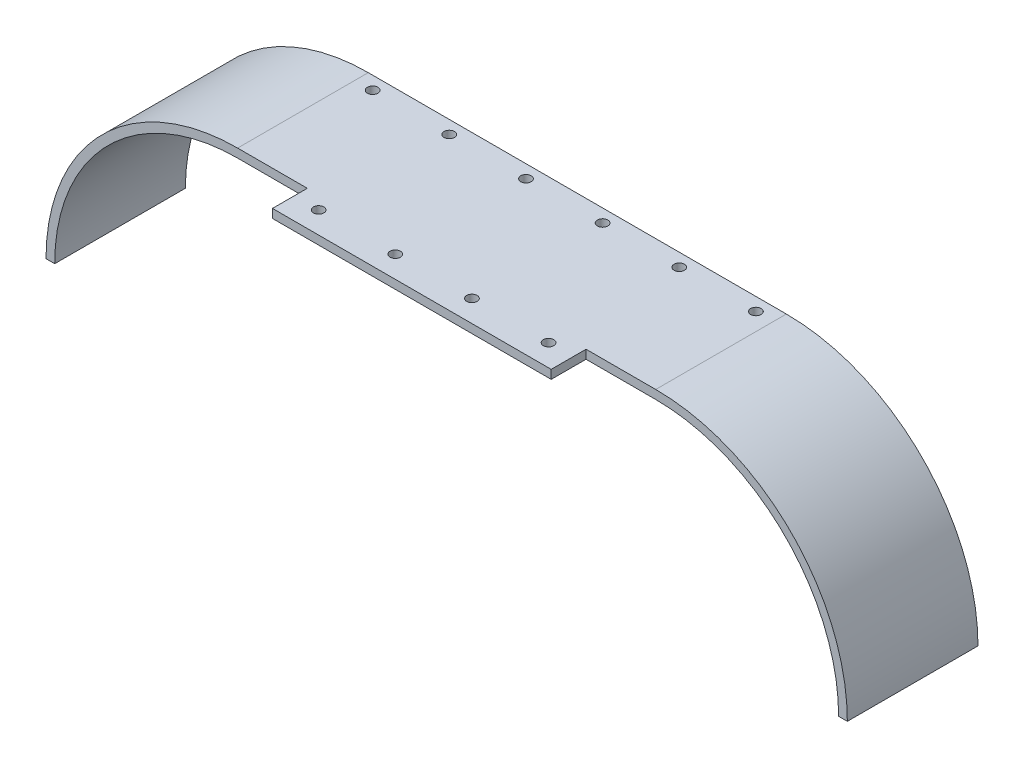
ISO-10303-21;
HEADER;
FILE_DESCRIPTION(('STEP AP214'),'2;1');
FILE_NAME('part.step','',(''),(''),'','','');
FILE_SCHEMA(('AUTOMOTIVE_DESIGN { 1 0 10303 214 1 1 1 1 }'));
ENDSEC;
DATA;
#1=APPLICATION_CONTEXT('core data for automotive mechanical design processes');
#2=APPLICATION_PROTOCOL_DEFINITION('international standard','automotive_design',2000,#1);
#3=PRODUCT_CONTEXT('',#1,'mechanical');
#4=PRODUCT('Part','Part','',(#3));
#5=PRODUCT_RELATED_PRODUCT_CATEGORY('part','',(#4));
#6=PRODUCT_DEFINITION_FORMATION('','',#4);
#7=PRODUCT_DEFINITION_CONTEXT('part definition',#1,'design');
#8=PRODUCT_DEFINITION('design','',#6,#7);
#9=PRODUCT_DEFINITION_SHAPE('','',#8);
#10=(LENGTH_UNIT() NAMED_UNIT(*) SI_UNIT(.MILLI.,.METRE.));
#11=(NAMED_UNIT(*) PLANE_ANGLE_UNIT() SI_UNIT($,.RADIAN.));
#12=(NAMED_UNIT(*) SI_UNIT($,.STERADIAN.) SOLID_ANGLE_UNIT());
#13=UNCERTAINTY_MEASURE_WITH_UNIT(LENGTH_MEASURE(1.E-05),#10,'distance_accuracy_value','');
#14=(GEOMETRIC_REPRESENTATION_CONTEXT(3) GLOBAL_UNCERTAINTY_ASSIGNED_CONTEXT((#13)) GLOBAL_UNIT_ASSIGNED_CONTEXT((#10,
#11,#12)) REPRESENTATION_CONTEXT('',''));
#15=CARTESIAN_POINT('',(0.,0.,0.));
#16=DIRECTION('',(0.,0.,1.));
#17=DIRECTION('',(1.,0.,0.));
#18=AXIS2_PLACEMENT_3D('',#15,#16,#17);
#19=CARTESIAN_POINT('',(0.,0.,37.5));
#20=DIRECTION('',(0.,0.,1.));
#21=DIRECTION('',(1.,0.,0.));
#22=AXIS2_PLACEMENT_3D('',#19,#20,#21);
#23=PLANE('',#22);
#24=DIRECTION('',(0.,-1.,0.));
#25=VECTOR('',#24,1.);
#26=CARTESIAN_POINT('',(-40.,55.,37.5));
#27=LINE('',#26,#25);
#28=CARTESIAN_POINT('',(-40.,55.,37.5));
#29=VERTEX_POINT('',#28);
#30=CARTESIAN_POINT('',(-40.,52.5,37.5));
#31=VERTEX_POINT('',#30);
#32=EDGE_CURVE('E52',#29,#31,#27,.T.);
#33=ORIENTED_EDGE('',*,*,#32,.F.);
#34=DIRECTION('',(1.,0.,0.));
#35=VECTOR('',#34,1.);
#36=CARTESIAN_POINT('',(0.,55.,37.5));
#37=LINE('',#36,#35);
#38=CARTESIAN_POINT('',(-60.,55.,37.5));
#39=VERTEX_POINT('',#38);
#40=EDGE_CURVE('E169',#39,#29,#37,.T.);
#41=ORIENTED_EDGE('',*,*,#40,.F.);
#42=CARTESIAN_POINT('',(-60.,0.,37.5));
#43=DIRECTION('',(0.,0.,1.));
#44=DIRECTION('',(1.,0.,0.));
#45=AXIS2_PLACEMENT_3D('',#42,#43,#44);
#46=CIRCLE('',#45,55.);
#47=CARTESIAN_POINT('',(-115.,0.,37.5));
#48=VERTEX_POINT('',#47);
#49=EDGE_CURVE('E171',#39,#48,#46,.T.);
#50=ORIENTED_EDGE('',*,*,#49,.T.);
#51=DIRECTION('',(1.,0.,0.));
#52=VECTOR('',#51,1.);
#53=CARTESIAN_POINT('',(0.,0.,37.5));
#54=LINE('',#53,#52);
#55=CARTESIAN_POINT('',(-112.5,0.,37.5));
#56=VERTEX_POINT('',#55);
#57=EDGE_CURVE('E165',#48,#56,#54,.T.);
#58=ORIENTED_EDGE('',*,*,#57,.T.);
#59=CARTESIAN_POINT('',(-60.,0.,37.5));
#60=DIRECTION('',(0.,0.,1.));
#61=DIRECTION('',(1.,0.,0.));
#62=AXIS2_PLACEMENT_3D('',#59,#60,#61);
#63=CIRCLE('',#62,52.5);
#64=CARTESIAN_POINT('',(-60.,52.5,37.5));
#65=VERTEX_POINT('',#64);
#66=EDGE_CURVE('E174',#65,#56,#63,.T.);
#67=ORIENTED_EDGE('',*,*,#66,.F.);
#68=DIRECTION('',(1.,0.,0.));
#69=VECTOR('',#68,1.);
#70=CARTESIAN_POINT('',(0.,52.5,37.5));
#71=LINE('',#70,#69);
#72=EDGE_CURVE('E157',#65,#31,#71,.T.);
#73=ORIENTED_EDGE('',*,*,#72,.T.);
#74=EDGE_LOOP('',(#33,#41,#50,#58,#67,#73));
#75=FACE_BOUND('',#74,.T.);
#76=ADVANCED_FACE('F37',(#75),#23,.T.);
#77=CARTESIAN_POINT('',(0.,52.5,37.5));
#78=DIRECTION('',(0.,1.,0.));
#79=DIRECTION('',(0.,0.,1.));
#80=AXIS2_PLACEMENT_3D('',#77,#78,#79);
#81=PLANE('',#80);
#82=CARTESIAN_POINT('',(-55.,52.5,3.75));
#83=DIRECTION('',(0.,1.,0.));
#84=DIRECTION('',(0.,0.,1.));
#85=AXIS2_PLACEMENT_3D('',#82,#83,#84);
#86=CIRCLE('',#85,1.5);
#87=CARTESIAN_POINT('',(-55.,52.5,5.25));
#88=VERTEX_POINT('',#87);
#89=EDGE_CURVE('E270',#88,#88,#86,.T.);
#90=ORIENTED_EDGE('',*,*,#89,.T.);
#91=EDGE_LOOP('',(#90));
#92=FACE_BOUND('',#91,.T.);
#93=CARTESIAN_POINT('',(-33.,52.5,3.75));
#94=DIRECTION('',(0.,1.,0.));
#95=DIRECTION('',(0.,0.,1.));
#96=AXIS2_PLACEMENT_3D('',#93,#94,#95);
#97=CIRCLE('',#96,1.5);
#98=CARTESIAN_POINT('',(-33.,52.5,5.25));
#99=VERTEX_POINT('',#98);
#100=EDGE_CURVE('E280',#99,#99,#97,.T.);
#101=ORIENTED_EDGE('',*,*,#100,.T.);
#102=EDGE_LOOP('',(#101));
#103=FACE_BOUND('',#102,.T.);
#104=CARTESIAN_POINT('',(-11.,52.5,3.75));
#105=DIRECTION('',(0.,1.,0.));
#106=DIRECTION('',(0.,0.,1.));
#107=AXIS2_PLACEMENT_3D('',#104,#105,#106);
#108=CIRCLE('',#107,1.5);
#109=CARTESIAN_POINT('',(-11.,52.5,5.25));
#110=VERTEX_POINT('',#109);
#111=EDGE_CURVE('E283',#110,#110,#108,.T.);
#112=ORIENTED_EDGE('',*,*,#111,.T.);
#113=EDGE_LOOP('',(#112));
#114=FACE_BOUND('',#113,.T.);
#115=CARTESIAN_POINT('',(11.,52.5,3.75));
#116=DIRECTION('',(0.,1.,0.));
#117=DIRECTION('',(0.,0.,1.));
#118=AXIS2_PLACEMENT_3D('',#115,#116,#117);
#119=CIRCLE('',#118,1.5);
#120=CARTESIAN_POINT('',(11.,52.5,5.25));
#121=VERTEX_POINT('',#120);
#122=EDGE_CURVE('E286',#121,#121,#119,.T.);
#123=ORIENTED_EDGE('',*,*,#122,.T.);
#124=EDGE_LOOP('',(#123));
#125=FACE_BOUND('',#124,.T.);
#126=CARTESIAN_POINT('',(33.,52.5,3.75));
#127=DIRECTION('',(0.,1.,0.));
#128=DIRECTION('',(0.,0.,1.));
#129=AXIS2_PLACEMENT_3D('',#126,#127,#128);
#130=CIRCLE('',#129,1.5);
#131=CARTESIAN_POINT('',(33.,52.5,5.25));
#132=VERTEX_POINT('',#131);
#133=EDGE_CURVE('E289',#132,#132,#130,.T.);
#134=ORIENTED_EDGE('',*,*,#133,.T.);
#135=EDGE_LOOP('',(#134));
#136=FACE_BOUND('',#135,.T.);
#137=CARTESIAN_POINT('',(55.,52.5,3.75));
#138=DIRECTION('',(0.,1.,0.));
#139=DIRECTION('',(0.,0.,1.));
#140=AXIS2_PLACEMENT_3D('',#137,#138,#139);
#141=CIRCLE('',#140,1.5);
#142=CARTESIAN_POINT('',(55.,52.5,5.25));
#143=VERTEX_POINT('',#142);
#144=EDGE_CURVE('E292',#143,#143,#141,.T.);
#145=ORIENTED_EDGE('',*,*,#144,.T.);
#146=EDGE_LOOP('',(#145));
#147=FACE_BOUND('',#146,.T.);
#148=CARTESIAN_POINT('',(-33.,52.5,41.25));
#149=DIRECTION('',(0.,1.,0.));
#150=DIRECTION('',(0.,0.,1.));
#151=AXIS2_PLACEMENT_3D('',#148,#149,#150);
#152=CIRCLE('',#151,1.5);
#153=CARTESIAN_POINT('',(-33.,52.5,42.75));
#154=VERTEX_POINT('',#153);
#155=EDGE_CURVE('E251',#154,#154,#152,.T.);
#156=ORIENTED_EDGE('',*,*,#155,.T.);
#157=EDGE_LOOP('',(#156));
#158=FACE_BOUND('',#157,.T.);
#159=CARTESIAN_POINT('',(-11.,52.5,41.25));
#160=DIRECTION('',(0.,1.,0.));
#161=DIRECTION('',(0.,0.,1.));
#162=AXIS2_PLACEMENT_3D('',#159,#160,#161);
#163=CIRCLE('',#162,1.5);
#164=CARTESIAN_POINT('',(-11.,52.5,42.75));
#165=VERTEX_POINT('',#164);
#166=EDGE_CURVE('E256',#165,#165,#163,.T.);
#167=ORIENTED_EDGE('',*,*,#166,.T.);
#168=EDGE_LOOP('',(#167));
#169=FACE_BOUND('',#168,.T.);
#170=CARTESIAN_POINT('',(11.,52.5,41.25));
#171=DIRECTION('',(0.,1.,0.));
#172=DIRECTION('',(0.,0.,1.));
#173=AXIS2_PLACEMENT_3D('',#170,#171,#172);
#174=CIRCLE('',#173,1.5);
#175=CARTESIAN_POINT('',(11.,52.5,42.75));
#176=VERTEX_POINT('',#175);
#177=EDGE_CURVE('E259',#176,#176,#174,.T.);
#178=ORIENTED_EDGE('',*,*,#177,.T.);
#179=EDGE_LOOP('',(#178));
#180=FACE_BOUND('',#179,.T.);
#181=CARTESIAN_POINT('',(33.,52.5,41.25));
#182=DIRECTION('',(0.,1.,0.));
#183=DIRECTION('',(0.,0.,1.));
#184=AXIS2_PLACEMENT_3D('',#181,#182,#183);
#185=CIRCLE('',#184,1.5);
#186=CARTESIAN_POINT('',(33.,52.5,42.75));
#187=VERTEX_POINT('',#186);
#188=EDGE_CURVE('E262',#187,#187,#185,.T.);
#189=ORIENTED_EDGE('',*,*,#188,.T.);
#190=EDGE_LOOP('',(#189));
#191=FACE_BOUND('',#190,.T.);
#192=DIRECTION('',(1.,0.,0.));
#193=VECTOR('',#192,1.);
#194=CARTESIAN_POINT('',(0.,52.5,0.));
#195=LINE('',#194,#193);
#196=CARTESIAN_POINT('',(-60.,52.5,0.));
#197=VERTEX_POINT('',#196);
#198=CARTESIAN_POINT('',(60.,52.5,0.));
#199=VERTEX_POINT('',#198);
#200=EDGE_CURVE('E149',#197,#199,#195,.T.);
#201=ORIENTED_EDGE('',*,*,#200,.T.);
#202=DIRECTION('',(0.,0.,-1.));
#203=VECTOR('',#202,1.);
#204=CARTESIAN_POINT('',(60.,52.5,37.5));
#205=LINE('',#204,#203);
#206=CARTESIAN_POINT('',(60.,52.5,37.5));
#207=VERTEX_POINT('',#206);
#208=EDGE_CURVE('E11',#207,#199,#205,.T.);
#209=ORIENTED_EDGE('',*,*,#208,.F.);
#210=CARTESIAN_POINT('',(40.,52.5,37.5));
#211=VERTEX_POINT('',#210);
#212=EDGE_CURVE('E160',#211,#207,#71,.T.);
#213=ORIENTED_EDGE('',*,*,#212,.F.);
#214=DIRECTION('',(0.,0.,-1.));
#215=VECTOR('',#214,1.);
#216=CARTESIAN_POINT('',(40.,52.5,47.5));
#217=LINE('',#216,#215);
#218=CARTESIAN_POINT('',(40.,52.5,47.5));
#219=VERTEX_POINT('',#218);
#220=EDGE_CURVE('E134',#219,#211,#217,.T.);
#221=ORIENTED_EDGE('',*,*,#220,.F.);
#222=DIRECTION('',(1.,0.,0.));
#223=VECTOR('',#222,1.);
#224=CARTESIAN_POINT('',(-40.,52.5,47.5));
#225=LINE('',#224,#223);
#226=CARTESIAN_POINT('',(-40.,52.5,47.5));
#227=VERTEX_POINT('',#226);
#228=EDGE_CURVE('E127',#227,#219,#225,.T.);
#229=ORIENTED_EDGE('',*,*,#228,.F.);
#230=DIRECTION('',(0.,0.,-1.));
#231=VECTOR('',#230,1.);
#232=CARTESIAN_POINT('',(-40.,52.5,47.5));
#233=LINE('',#232,#231);
#234=EDGE_CURVE('E132',#227,#31,#233,.T.);
#235=ORIENTED_EDGE('',*,*,#234,.T.);
#236=ORIENTED_EDGE('',*,*,#72,.F.);
#237=DIRECTION('',(0.,0.,-1.));
#238=VECTOR('',#237,1.);
#239=CARTESIAN_POINT('',(-60.,52.5,37.5));
#240=LINE('',#239,#238);
#241=EDGE_CURVE('E177',#65,#197,#240,.T.);
#242=ORIENTED_EDGE('',*,*,#241,.T.);
#243=EDGE_LOOP('',(#201,#209,#213,#221,#229,#235,#236,#242));
#244=FACE_BOUND('',#243,.T.);
#245=ADVANCED_FACE('F39',(#92,#103,#114,#125,#136,#147,#158,#169,#180,#191,#244),#81,.F.);
#246=CARTESIAN_POINT('',(60.,0.,37.5));
#247=DIRECTION('',(0.,0.,-1.));
#248=DIRECTION('',(-1.,0.,0.));
#249=AXIS2_PLACEMENT_3D('',#246,#247,#248);
#250=CYLINDRICAL_SURFACE('',#249,52.5);
#251=CARTESIAN_POINT('',(60.,0.,0.));
#252=DIRECTION('',(0.,0.,1.));
#253=DIRECTION('',(1.,0.,0.));
#254=AXIS2_PLACEMENT_3D('',#251,#252,#253);
#255=CIRCLE('',#254,52.5);
#256=CARTESIAN_POINT('',(112.5,0.,0.));
#257=VERTEX_POINT('',#256);
#258=EDGE_CURVE('E151',#199,#257,#255,.F.);
#259=ORIENTED_EDGE('',*,*,#258,.T.);
#260=DIRECTION('',(0.,0.,-1.));
#261=VECTOR('',#260,1.);
#262=CARTESIAN_POINT('',(112.5,0.,37.5));
#263=LINE('',#262,#261);
#264=CARTESIAN_POINT('',(112.5,0.,37.5));
#265=VERTEX_POINT('',#264);
#266=EDGE_CURVE('E45',#265,#257,#263,.T.);
#267=ORIENTED_EDGE('',*,*,#266,.F.);
#268=CARTESIAN_POINT('',(60.,0.,37.5));
#269=DIRECTION('',(0.,0.,1.));
#270=DIRECTION('',(1.,0.,0.));
#271=AXIS2_PLACEMENT_3D('',#268,#269,#270);
#272=CIRCLE('',#271,52.5);
#273=EDGE_CURVE('E159',#207,#265,#272,.F.);
#274=ORIENTED_EDGE('',*,*,#273,.F.);
#275=ORIENTED_EDGE('',*,*,#208,.T.);
#276=EDGE_LOOP('',(#259,#267,#274,#275));
#277=FACE_BOUND('',#276,.T.);
#278=ADVANCED_FACE('F227',(#277),#250,.F.);
#279=CARTESIAN_POINT('',(0.,0.,37.5));
#280=DIRECTION('',(0.,1.,0.));
#281=DIRECTION('',(0.,0.,1.));
#282=AXIS2_PLACEMENT_3D('',#279,#280,#281);
#283=PLANE('',#282);
#284=DIRECTION('',(1.,0.,0.));
#285=VECTOR('',#284,1.);
#286=CARTESIAN_POINT('',(0.,0.,0.));
#287=LINE('',#286,#285);
#288=CARTESIAN_POINT('',(115.,0.,0.));
#289=VERTEX_POINT('',#288);
#290=EDGE_CURVE('E180',#257,#289,#287,.T.);
#291=ORIENTED_EDGE('',*,*,#290,.T.);
#292=DIRECTION('',(0.,0.,-1.));
#293=VECTOR('',#292,1.);
#294=CARTESIAN_POINT('',(115.,0.,37.5));
#295=LINE('',#294,#293);
#296=CARTESIAN_POINT('',(115.,0.,37.5));
#297=VERTEX_POINT('',#296);
#298=EDGE_CURVE('E205',#297,#289,#295,.T.);
#299=ORIENTED_EDGE('',*,*,#298,.F.);
#300=EDGE_CURVE('E162',#265,#297,#54,.T.);
#301=ORIENTED_EDGE('',*,*,#300,.F.);
#302=ORIENTED_EDGE('',*,*,#266,.T.);
#303=EDGE_LOOP('',(#291,#299,#301,#302));
#304=FACE_BOUND('',#303,.T.);
#305=ADVANCED_FACE('F211',(#304),#283,.F.);
#306=CARTESIAN_POINT('',(60.,0.,37.5));
#307=DIRECTION('',(0.,0.,-1.));
#308=DIRECTION('',(-1.,0.,0.));
#309=AXIS2_PLACEMENT_3D('',#306,#307,#308);
#310=CYLINDRICAL_SURFACE('',#309,55.);
#311=CARTESIAN_POINT('',(60.,0.,0.));
#312=DIRECTION('',(0.,0.,1.));
#313=DIRECTION('',(1.,0.,0.));
#314=AXIS2_PLACEMENT_3D('',#311,#312,#313);
#315=CIRCLE('',#314,55.);
#316=CARTESIAN_POINT('',(60.,55.,0.));
#317=VERTEX_POINT('',#316);
#318=EDGE_CURVE('E183',#317,#289,#315,.F.);
#319=ORIENTED_EDGE('',*,*,#318,.F.);
#320=DIRECTION('',(0.,0.,-1.));
#321=VECTOR('',#320,1.);
#322=CARTESIAN_POINT('',(60.,55.,37.5));
#323=LINE('',#322,#321);
#324=CARTESIAN_POINT('',(60.,55.,37.5));
#325=VERTEX_POINT('',#324);
#326=EDGE_CURVE('E203',#325,#317,#323,.T.);
#327=ORIENTED_EDGE('',*,*,#326,.F.);
#328=CARTESIAN_POINT('',(60.,0.,37.5));
#329=DIRECTION('',(0.,0.,1.));
#330=DIRECTION('',(1.,0.,0.));
#331=AXIS2_PLACEMENT_3D('',#328,#329,#330);
#332=CIRCLE('',#331,55.);
#333=EDGE_CURVE('E164',#325,#297,#332,.F.);
#334=ORIENTED_EDGE('',*,*,#333,.T.);
#335=ORIENTED_EDGE('',*,*,#298,.T.);
#336=EDGE_LOOP('',(#319,#327,#334,#335));
#337=FACE_BOUND('',#336,.T.);
#338=ADVANCED_FACE('F223',(#337),#310,.T.);
#339=CARTESIAN_POINT('',(0.,55.,37.5));
#340=DIRECTION('',(0.,1.,0.));
#341=DIRECTION('',(0.,0.,1.));
#342=AXIS2_PLACEMENT_3D('',#339,#340,#341);
#343=PLANE('',#342);
#344=CARTESIAN_POINT('',(-55.,55.,3.75));
#345=DIRECTION('',(0.,1.,0.));
#346=DIRECTION('',(0.,0.,1.));
#347=AXIS2_PLACEMENT_3D('',#344,#345,#346);
#348=CIRCLE('',#347,1.5);
#349=CARTESIAN_POINT('',(-55.,55.,5.25));
#350=VERTEX_POINT('',#349);
#351=EDGE_CURVE('E295',#350,#350,#348,.T.);
#352=ORIENTED_EDGE('',*,*,#351,.F.);
#353=EDGE_LOOP('',(#352));
#354=FACE_BOUND('',#353,.T.);
#355=CARTESIAN_POINT('',(-33.,55.,3.75));
#356=DIRECTION('',(0.,1.,0.));
#357=DIRECTION('',(0.,0.,1.));
#358=AXIS2_PLACEMENT_3D('',#355,#356,#357);
#359=CIRCLE('',#358,1.5);
#360=CARTESIAN_POINT('',(-33.,55.,5.25));
#361=VERTEX_POINT('',#360);
#362=EDGE_CURVE('E308',#361,#361,#359,.T.);
#363=ORIENTED_EDGE('',*,*,#362,.F.);
#364=EDGE_LOOP('',(#363));
#365=FACE_BOUND('',#364,.T.);
#366=CARTESIAN_POINT('',(-11.,55.,3.75));
#367=DIRECTION('',(0.,1.,0.));
#368=DIRECTION('',(0.,0.,1.));
#369=AXIS2_PLACEMENT_3D('',#366,#367,#368);
#370=CIRCLE('',#369,1.5);
#371=CARTESIAN_POINT('',(-11.,55.,5.25));
#372=VERTEX_POINT('',#371);
#373=EDGE_CURVE('E305',#372,#372,#370,.T.);
#374=ORIENTED_EDGE('',*,*,#373,.F.);
#375=EDGE_LOOP('',(#374));
#376=FACE_BOUND('',#375,.T.);
#377=CARTESIAN_POINT('',(11.,55.,3.75));
#378=DIRECTION('',(0.,1.,0.));
#379=DIRECTION('',(0.,0.,1.));
#380=AXIS2_PLACEMENT_3D('',#377,#378,#379);
#381=CIRCLE('',#380,1.5);
#382=CARTESIAN_POINT('',(11.,55.,5.25));
#383=VERTEX_POINT('',#382);
#384=EDGE_CURVE('E302',#383,#383,#381,.T.);
#385=ORIENTED_EDGE('',*,*,#384,.F.);
#386=EDGE_LOOP('',(#385));
#387=FACE_BOUND('',#386,.T.);
#388=CARTESIAN_POINT('',(33.,55.,3.75));
#389=DIRECTION('',(0.,1.,0.));
#390=DIRECTION('',(0.,0.,1.));
#391=AXIS2_PLACEMENT_3D('',#388,#389,#390);
#392=CIRCLE('',#391,1.5);
#393=CARTESIAN_POINT('',(33.,55.,5.25));
#394=VERTEX_POINT('',#393);
#395=EDGE_CURVE('E299',#394,#394,#392,.T.);
#396=ORIENTED_EDGE('',*,*,#395,.F.);
#397=EDGE_LOOP('',(#396));
#398=FACE_BOUND('',#397,.T.);
#399=CARTESIAN_POINT('',(55.,55.,3.75));
#400=DIRECTION('',(0.,1.,0.));
#401=DIRECTION('',(0.,0.,1.));
#402=AXIS2_PLACEMENT_3D('',#399,#400,#401);
#403=CIRCLE('',#402,1.5);
#404=CARTESIAN_POINT('',(55.,55.,5.25));
#405=VERTEX_POINT('',#404);
#406=EDGE_CURVE('E296',#405,#405,#403,.T.);
#407=ORIENTED_EDGE('',*,*,#406,.F.);
#408=EDGE_LOOP('',(#407));
#409=FACE_BOUND('',#408,.T.);
#410=CARTESIAN_POINT('',(-33.,55.,41.25));
#411=DIRECTION('',(0.,1.,0.));
#412=DIRECTION('',(0.,0.,1.));
#413=AXIS2_PLACEMENT_3D('',#410,#411,#412);
#414=CIRCLE('',#413,1.5);
#415=CARTESIAN_POINT('',(-33.,55.,42.75));
#416=VERTEX_POINT('',#415);
#417=EDGE_CURVE('E265',#416,#416,#414,.T.);
#418=ORIENTED_EDGE('',*,*,#417,.F.);
#419=EDGE_LOOP('',(#418));
#420=FACE_BOUND('',#419,.T.);
#421=CARTESIAN_POINT('',(-11.,55.,41.25));
#422=DIRECTION('',(0.,1.,0.));
#423=DIRECTION('',(0.,0.,1.));
#424=AXIS2_PLACEMENT_3D('',#421,#422,#423);
#425=CIRCLE('',#424,1.5);
#426=CARTESIAN_POINT('',(-11.,55.,42.75));
#427=VERTEX_POINT('',#426);
#428=EDGE_CURVE('E273',#427,#427,#425,.T.);
#429=ORIENTED_EDGE('',*,*,#428,.F.);
#430=EDGE_LOOP('',(#429));
#431=FACE_BOUND('',#430,.T.);
#432=CARTESIAN_POINT('',(11.,55.,41.25));
#433=DIRECTION('',(0.,1.,0.));
#434=DIRECTION('',(0.,0.,1.));
#435=AXIS2_PLACEMENT_3D('',#432,#433,#434);
#436=CIRCLE('',#435,1.5);
#437=CARTESIAN_POINT('',(11.,55.,42.75));
#438=VERTEX_POINT('',#437);
#439=EDGE_CURVE('E269',#438,#438,#436,.T.);
#440=ORIENTED_EDGE('',*,*,#439,.F.);
#441=EDGE_LOOP('',(#440));
#442=FACE_BOUND('',#441,.T.);
#443=CARTESIAN_POINT('',(33.,55.,41.25));
#444=DIRECTION('',(0.,1.,0.));
#445=DIRECTION('',(0.,0.,1.));
#446=AXIS2_PLACEMENT_3D('',#443,#444,#445);
#447=CIRCLE('',#446,1.5);
#448=CARTESIAN_POINT('',(33.,55.,42.75));
#449=VERTEX_POINT('',#448);
#450=EDGE_CURVE('E266',#449,#449,#447,.T.);
#451=ORIENTED_EDGE('',*,*,#450,.F.);
#452=EDGE_LOOP('',(#451));
#453=FACE_BOUND('',#452,.T.);
#454=DIRECTION('',(1.,0.,0.));
#455=VECTOR('',#454,1.);
#456=CARTESIAN_POINT('',(0.,55.,0.));
#457=LINE('',#456,#455);
#458=CARTESIAN_POINT('',(-60.,55.,0.));
#459=VERTEX_POINT('',#458);
#460=EDGE_CURVE('E187',#459,#317,#457,.T.);
#461=ORIENTED_EDGE('',*,*,#460,.F.);
#462=DIRECTION('',(0.,0.,-1.));
#463=VECTOR('',#462,1.);
#464=CARTESIAN_POINT('',(-60.,55.,37.5));
#465=LINE('',#464,#463);
#466=EDGE_CURVE('E201',#39,#459,#465,.T.);
#467=ORIENTED_EDGE('',*,*,#466,.F.);
#468=ORIENTED_EDGE('',*,*,#40,.T.);
#469=DIRECTION('',(0.,0.,-1.));
#470=VECTOR('',#469,1.);
#471=CARTESIAN_POINT('',(-40.,55.,47.5));
#472=LINE('',#471,#470);
#473=CARTESIAN_POINT('',(-40.,55.,47.5));
#474=VERTEX_POINT('',#473);
#475=EDGE_CURVE('E246',#474,#29,#472,.T.);
#476=ORIENTED_EDGE('',*,*,#475,.F.);
#477=DIRECTION('',(-1.,0.,0.));
#478=VECTOR('',#477,1.);
#479=CARTESIAN_POINT('',(-40.,55.,47.5));
#480=LINE('',#479,#478);
#481=CARTESIAN_POINT('',(40.,55.,47.5));
#482=VERTEX_POINT('',#481);
#483=EDGE_CURVE('E143',#482,#474,#480,.T.);
#484=ORIENTED_EDGE('',*,*,#483,.F.);
#485=DIRECTION('',(0.,0.,-1.));
#486=VECTOR('',#485,1.);
#487=CARTESIAN_POINT('',(40.,55.,47.5));
#488=LINE('',#487,#486);
#489=CARTESIAN_POINT('',(40.,55.,37.5));
#490=VERTEX_POINT('',#489);
#491=EDGE_CURVE('E153',#482,#490,#488,.T.);
#492=ORIENTED_EDGE('',*,*,#491,.T.);
#493=EDGE_CURVE('E168',#490,#325,#37,.T.);
#494=ORIENTED_EDGE('',*,*,#493,.T.);
#495=ORIENTED_EDGE('',*,*,#326,.T.);
#496=EDGE_LOOP('',(#461,#467,#468,#476,#484,#492,#494,#495));
#497=FACE_BOUND('',#496,.T.);
#498=ADVANCED_FACE('F241',(#354,#365,#376,#387,#398,#409,#420,#431,#442,#453,#497),#343,.T.);
#499=CARTESIAN_POINT('',(-60.,0.,37.5));
#500=DIRECTION('',(0.,0.,-1.));
#501=DIRECTION('',(-1.,0.,0.));
#502=AXIS2_PLACEMENT_3D('',#499,#500,#501);
#503=CYLINDRICAL_SURFACE('',#502,55.);
#504=CARTESIAN_POINT('',(-60.,0.,0.));
#505=DIRECTION('',(0.,0.,1.));
#506=DIRECTION('',(1.,0.,0.));
#507=AXIS2_PLACEMENT_3D('',#504,#505,#506);
#508=CIRCLE('',#507,55.);
#509=CARTESIAN_POINT('',(-115.,0.,0.));
#510=VERTEX_POINT('',#509);
#511=EDGE_CURVE('E190',#459,#510,#508,.T.);
#512=ORIENTED_EDGE('',*,*,#511,.T.);
#513=DIRECTION('',(0.,0.,-1.));
#514=VECTOR('',#513,1.);
#515=CARTESIAN_POINT('',(-115.,0.,37.5));
#516=LINE('',#515,#514);
#517=EDGE_CURVE('E198',#48,#510,#516,.T.);
#518=ORIENTED_EDGE('',*,*,#517,.F.);
#519=ORIENTED_EDGE('',*,*,#49,.F.);
#520=ORIENTED_EDGE('',*,*,#466,.T.);
#521=EDGE_LOOP('',(#512,#518,#519,#520));
#522=FACE_BOUND('',#521,.T.);
#523=ADVANCED_FACE('F319',(#522),#503,.T.);
#524=CARTESIAN_POINT('',(-112.5,0.,0.));
#525=VERTEX_POINT('',#524);
#526=EDGE_CURVE('E184',#510,#525,#287,.T.);
#527=ORIENTED_EDGE('',*,*,#526,.T.);
#528=DIRECTION('',(0.,0.,-1.));
#529=VECTOR('',#528,1.);
#530=CARTESIAN_POINT('',(-112.5,0.,37.5));
#531=LINE('',#530,#529);
#532=EDGE_CURVE('E196',#56,#525,#531,.T.);
#533=ORIENTED_EDGE('',*,*,#532,.F.);
#534=ORIENTED_EDGE('',*,*,#57,.F.);
#535=ORIENTED_EDGE('',*,*,#517,.T.);
#536=EDGE_LOOP('',(#527,#533,#534,#535));
#537=FACE_BOUND('',#536,.T.);
#538=ADVANCED_FACE('F237',(#537),#283,.F.);
#539=CARTESIAN_POINT('',(-60.,0.,37.5));
#540=DIRECTION('',(0.,0.,-1.));
#541=DIRECTION('',(-1.,0.,0.));
#542=AXIS2_PLACEMENT_3D('',#539,#540,#541);
#543=CYLINDRICAL_SURFACE('',#542,52.5);
#544=CARTESIAN_POINT('',(-60.,0.,0.));
#545=DIRECTION('',(0.,0.,1.));
#546=DIRECTION('',(1.,0.,0.));
#547=AXIS2_PLACEMENT_3D('',#544,#545,#546);
#548=CIRCLE('',#547,52.5);
#549=EDGE_CURVE('E192',#197,#525,#548,.T.);
#550=ORIENTED_EDGE('',*,*,#549,.F.);
#551=ORIENTED_EDGE('',*,*,#241,.F.);
#552=ORIENTED_EDGE('',*,*,#66,.T.);
#553=ORIENTED_EDGE('',*,*,#532,.T.);
#554=EDGE_LOOP('',(#550,#551,#552,#553));
#555=FACE_BOUND('',#554,.T.);
#556=ADVANCED_FACE('F231',(#555),#543,.F.);
#557=DIRECTION('',(0.,1.,0.));
#558=VECTOR('',#557,1.);
#559=CARTESIAN_POINT('',(40.,55.,37.5));
#560=LINE('',#559,#558);
#561=EDGE_CURVE('E60',#211,#490,#560,.T.);
#562=ORIENTED_EDGE('',*,*,#561,.F.);
#563=ORIENTED_EDGE('',*,*,#212,.T.);
#564=ORIENTED_EDGE('',*,*,#273,.T.);
#565=ORIENTED_EDGE('',*,*,#300,.T.);
#566=ORIENTED_EDGE('',*,*,#333,.F.);
#567=ORIENTED_EDGE('',*,*,#493,.F.);
#568=EDGE_LOOP('',(#562,#563,#564,#565,#566,#567));
#569=FACE_BOUND('',#568,.T.);
#570=ADVANCED_FACE('F225',(#569),#23,.T.);
#571=CARTESIAN_POINT('',(0.,0.,0.));
#572=DIRECTION('',(0.,0.,1.));
#573=DIRECTION('',(1.,0.,0.));
#574=AXIS2_PLACEMENT_3D('',#571,#572,#573);
#575=PLANE('',#574);
#576=ORIENTED_EDGE('',*,*,#200,.F.);
#577=ORIENTED_EDGE('',*,*,#549,.T.);
#578=ORIENTED_EDGE('',*,*,#526,.F.);
#579=ORIENTED_EDGE('',*,*,#511,.F.);
#580=ORIENTED_EDGE('',*,*,#460,.T.);
#581=ORIENTED_EDGE('',*,*,#318,.T.);
#582=ORIENTED_EDGE('',*,*,#290,.F.);
#583=ORIENTED_EDGE('',*,*,#258,.F.);
#584=EDGE_LOOP('',(#576,#577,#578,#579,#580,#581,#582,#583));
#585=FACE_BOUND('',#584,.T.);
#586=ADVANCED_FACE('F217',(#585),#575,.F.);
#587=CARTESIAN_POINT('',(-40.,55.,47.5));
#588=DIRECTION('',(1.,0.,0.));
#589=DIRECTION('',(0.,0.,-1.));
#590=AXIS2_PLACEMENT_3D('',#587,#588,#589);
#591=PLANE('',#590);
#592=ORIENTED_EDGE('',*,*,#32,.T.);
#593=ORIENTED_EDGE('',*,*,#234,.F.);
#594=DIRECTION('',(0.,-1.,0.));
#595=VECTOR('',#594,1.);
#596=CARTESIAN_POINT('',(-40.,55.,47.5));
#597=LINE('',#596,#595);
#598=EDGE_CURVE('E138',#474,#227,#597,.T.);
#599=ORIENTED_EDGE('',*,*,#598,.F.);
#600=ORIENTED_EDGE('',*,*,#475,.T.);
#601=EDGE_LOOP('',(#592,#593,#599,#600));
#602=FACE_BOUND('',#601,.T.);
#603=ADVANCED_FACE('F148',(#602),#591,.F.);
#604=CARTESIAN_POINT('',(40.,55.,47.5));
#605=DIRECTION('',(-1.,0.,0.));
#606=DIRECTION('',(0.,0.,1.));
#607=AXIS2_PLACEMENT_3D('',#604,#605,#606);
#608=PLANE('',#607);
#609=ORIENTED_EDGE('',*,*,#561,.T.);
#610=ORIENTED_EDGE('',*,*,#491,.F.);
#611=DIRECTION('',(0.,1.,0.));
#612=VECTOR('',#611,1.);
#613=CARTESIAN_POINT('',(40.,55.,47.5));
#614=LINE('',#613,#612);
#615=EDGE_CURVE('E137',#219,#482,#614,.T.);
#616=ORIENTED_EDGE('',*,*,#615,.F.);
#617=ORIENTED_EDGE('',*,*,#220,.T.);
#618=EDGE_LOOP('',(#609,#610,#616,#617));
#619=FACE_BOUND('',#618,.T.);
#620=ADVANCED_FACE('F385',(#619),#608,.F.);
#621=CARTESIAN_POINT('',(0.,0.,47.5));
#622=DIRECTION('',(0.,0.,1.));
#623=DIRECTION('',(1.,0.,0.));
#624=AXIS2_PLACEMENT_3D('',#621,#622,#623);
#625=PLANE('',#624);
#626=ORIENTED_EDGE('',*,*,#598,.T.);
#627=ORIENTED_EDGE('',*,*,#228,.T.);
#628=ORIENTED_EDGE('',*,*,#615,.T.);
#629=ORIENTED_EDGE('',*,*,#483,.T.);
#630=EDGE_LOOP('',(#626,#627,#628,#629));
#631=FACE_BOUND('',#630,.T.);
#632=ADVANCED_FACE('F141',(#631),#625,.T.);
#633=CARTESIAN_POINT('',(33.,45.,41.25));
#634=DIRECTION('',(0.,1.,0.));
#635=DIRECTION('',(0.,0.,1.));
#636=AXIS2_PLACEMENT_3D('',#633,#634,#635);
#637=CYLINDRICAL_SURFACE('',#636,1.5);
#638=ORIENTED_EDGE('',*,*,#450,.T.);
#639=EDGE_LOOP('',(#638));
#640=FACE_BOUND('',#639,.T.);
#641=ORIENTED_EDGE('',*,*,#188,.F.);
#642=EDGE_LOOP('',(#641));
#643=FACE_BOUND('',#642,.T.);
#644=ADVANCED_FACE('F339',(#640,#643),#637,.F.);
#645=CARTESIAN_POINT('',(11.,45.,41.25));
#646=DIRECTION('',(0.,1.,0.));
#647=DIRECTION('',(0.,0.,1.));
#648=AXIS2_PLACEMENT_3D('',#645,#646,#647);
#649=CYLINDRICAL_SURFACE('',#648,1.5);
#650=ORIENTED_EDGE('',*,*,#439,.T.);
#651=EDGE_LOOP('',(#650));
#652=FACE_BOUND('',#651,.T.);
#653=ORIENTED_EDGE('',*,*,#177,.F.);
#654=EDGE_LOOP('',(#653));
#655=FACE_BOUND('',#654,.T.);
#656=ADVANCED_FACE('F342',(#652,#655),#649,.F.);
#657=CARTESIAN_POINT('',(-11.,45.,41.25));
#658=DIRECTION('',(0.,1.,0.));
#659=DIRECTION('',(0.,0.,1.));
#660=AXIS2_PLACEMENT_3D('',#657,#658,#659);
#661=CYLINDRICAL_SURFACE('',#660,1.5);
#662=ORIENTED_EDGE('',*,*,#428,.T.);
#663=EDGE_LOOP('',(#662));
#664=FACE_BOUND('',#663,.T.);
#665=ORIENTED_EDGE('',*,*,#166,.F.);
#666=EDGE_LOOP('',(#665));
#667=FACE_BOUND('',#666,.T.);
#668=ADVANCED_FACE('F372',(#664,#667),#661,.F.);
#669=CARTESIAN_POINT('',(-33.,45.,41.25));
#670=DIRECTION('',(0.,1.,0.));
#671=DIRECTION('',(0.,0.,1.));
#672=AXIS2_PLACEMENT_3D('',#669,#670,#671);
#673=CYLINDRICAL_SURFACE('',#672,1.5);
#674=ORIENTED_EDGE('',*,*,#417,.T.);
#675=EDGE_LOOP('',(#674));
#676=FACE_BOUND('',#675,.T.);
#677=ORIENTED_EDGE('',*,*,#155,.F.);
#678=EDGE_LOOP('',(#677));
#679=FACE_BOUND('',#678,.T.);
#680=ADVANCED_FACE('F378',(#676,#679),#673,.F.);
#681=CARTESIAN_POINT('',(55.,45.,3.75));
#682=DIRECTION('',(0.,1.,0.));
#683=DIRECTION('',(0.,0.,1.));
#684=AXIS2_PLACEMENT_3D('',#681,#682,#683);
#685=CYLINDRICAL_SURFACE('',#684,1.5);
#686=ORIENTED_EDGE('',*,*,#406,.T.);
#687=EDGE_LOOP('',(#686));
#688=FACE_BOUND('',#687,.T.);
#689=ORIENTED_EDGE('',*,*,#144,.F.);
#690=EDGE_LOOP('',(#689));
#691=FACE_BOUND('',#690,.T.);
#692=ADVANCED_FACE('F473',(#688,#691),#685,.F.);
#693=CARTESIAN_POINT('',(33.,45.,3.75));
#694=DIRECTION('',(0.,1.,0.));
#695=DIRECTION('',(0.,0.,1.));
#696=AXIS2_PLACEMENT_3D('',#693,#694,#695);
#697=CYLINDRICAL_SURFACE('',#696,1.5);
#698=ORIENTED_EDGE('',*,*,#395,.T.);
#699=EDGE_LOOP('',(#698));
#700=FACE_BOUND('',#699,.T.);
#701=ORIENTED_EDGE('',*,*,#133,.F.);
#702=EDGE_LOOP('',(#701));
#703=FACE_BOUND('',#702,.T.);
#704=ADVANCED_FACE('F478',(#700,#703),#697,.F.);
#705=CARTESIAN_POINT('',(11.,45.,3.75));
#706=DIRECTION('',(0.,1.,0.));
#707=DIRECTION('',(0.,0.,1.));
#708=AXIS2_PLACEMENT_3D('',#705,#706,#707);
#709=CYLINDRICAL_SURFACE('',#708,1.5);
#710=ORIENTED_EDGE('',*,*,#384,.T.);
#711=EDGE_LOOP('',(#710));
#712=FACE_BOUND('',#711,.T.);
#713=ORIENTED_EDGE('',*,*,#122,.F.);
#714=EDGE_LOOP('',(#713));
#715=FACE_BOUND('',#714,.T.);
#716=ADVANCED_FACE('F488',(#712,#715),#709,.F.);
#717=CARTESIAN_POINT('',(-11.,45.,3.75));
#718=DIRECTION('',(0.,1.,0.));
#719=DIRECTION('',(0.,0.,1.));
#720=AXIS2_PLACEMENT_3D('',#717,#718,#719);
#721=CYLINDRICAL_SURFACE('',#720,1.5);
#722=ORIENTED_EDGE('',*,*,#373,.T.);
#723=EDGE_LOOP('',(#722));
#724=FACE_BOUND('',#723,.T.);
#725=ORIENTED_EDGE('',*,*,#111,.F.);
#726=EDGE_LOOP('',(#725));
#727=FACE_BOUND('',#726,.T.);
#728=ADVANCED_FACE('F498',(#724,#727),#721,.F.);
#729=CARTESIAN_POINT('',(-33.,45.,3.75));
#730=DIRECTION('',(0.,1.,0.));
#731=DIRECTION('',(0.,0.,1.));
#732=AXIS2_PLACEMENT_3D('',#729,#730,#731);
#733=CYLINDRICAL_SURFACE('',#732,1.5);
#734=ORIENTED_EDGE('',*,*,#362,.T.);
#735=EDGE_LOOP('',(#734));
#736=FACE_BOUND('',#735,.T.);
#737=ORIENTED_EDGE('',*,*,#100,.F.);
#738=EDGE_LOOP('',(#737));
#739=FACE_BOUND('',#738,.T.);
#740=ADVANCED_FACE('F508',(#736,#739),#733,.F.);
#741=CARTESIAN_POINT('',(-55.,45.,3.75));
#742=DIRECTION('',(0.,1.,0.));
#743=DIRECTION('',(0.,0.,1.));
#744=AXIS2_PLACEMENT_3D('',#741,#742,#743);
#745=CYLINDRICAL_SURFACE('',#744,1.5);
#746=ORIENTED_EDGE('',*,*,#351,.T.);
#747=EDGE_LOOP('',(#746));
#748=FACE_BOUND('',#747,.T.);
#749=ORIENTED_EDGE('',*,*,#89,.F.);
#750=EDGE_LOOP('',(#749));
#751=FACE_BOUND('',#750,.T.);
#752=ADVANCED_FACE('F314',(#748,#751),#745,.F.);
#753=CLOSED_SHELL('',(#76,#245,#278,#305,#338,#498,#523,#538,#556,#570,#586,#603,#620,#632,#644,
#656,#668,#680,#692,#704,#716,#728,#740,#752));
#754=MANIFOLD_SOLID_BREP('B2',#753);
#755=ADVANCED_BREP_SHAPE_REPRESENTATION('',(#18,#754),#14);
#756=SHAPE_DEFINITION_REPRESENTATION(#9,#755);
ENDSEC;
END-ISO-10303-21;
